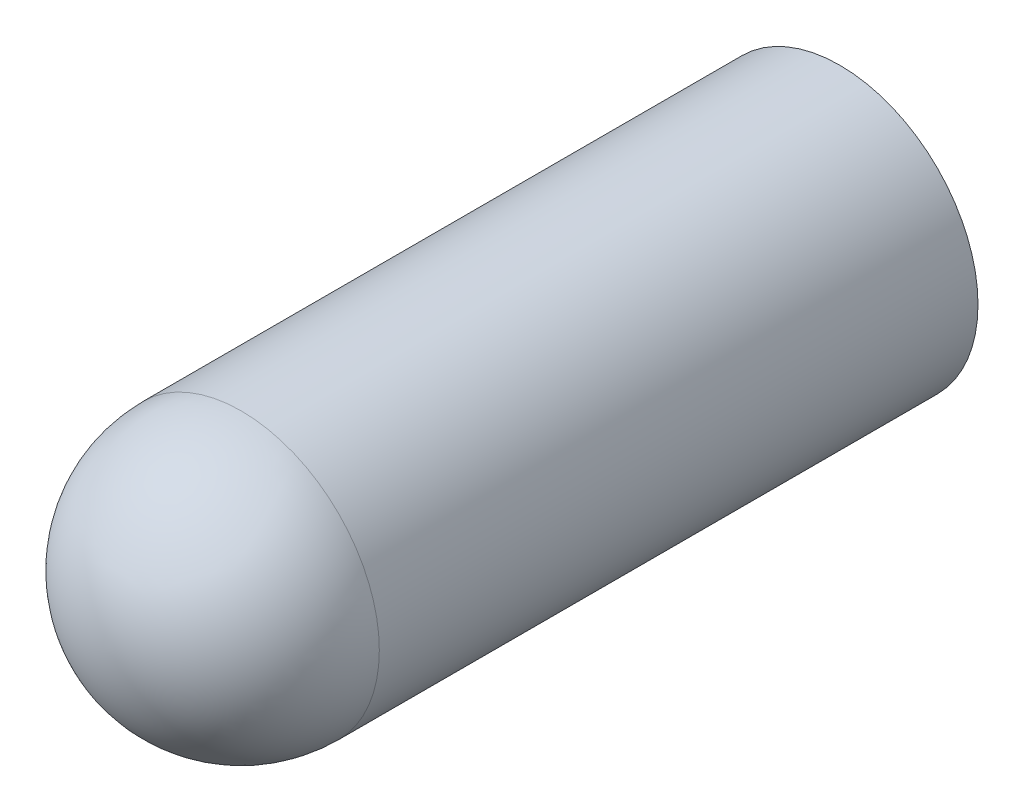
ISO-10303-21;
HEADER;
FILE_DESCRIPTION(('STEP AP214'),'2;1');
FILE_NAME('part.step','',(''),(''),'','','');
FILE_SCHEMA(('AUTOMOTIVE_DESIGN { 1 0 10303 214 1 1 1 1 }'));
ENDSEC;
DATA;
#1=APPLICATION_CONTEXT('core data for automotive mechanical design processes');
#2=APPLICATION_PROTOCOL_DEFINITION('international standard','automotive_design',2000,#1);
#3=PRODUCT_CONTEXT('',#1,'mechanical');
#4=PRODUCT('Part','Part','',(#3));
#5=PRODUCT_RELATED_PRODUCT_CATEGORY('part','',(#4));
#6=PRODUCT_DEFINITION_FORMATION('','',#4);
#7=PRODUCT_DEFINITION_CONTEXT('part definition',#1,'design');
#8=PRODUCT_DEFINITION('design','',#6,#7);
#9=PRODUCT_DEFINITION_SHAPE('','',#8);
#10=(LENGTH_UNIT() NAMED_UNIT(*) SI_UNIT(.MILLI.,.METRE.));
#11=(NAMED_UNIT(*) PLANE_ANGLE_UNIT() SI_UNIT($,.RADIAN.));
#12=(NAMED_UNIT(*) SI_UNIT($,.STERADIAN.) SOLID_ANGLE_UNIT());
#13=UNCERTAINTY_MEASURE_WITH_UNIT(LENGTH_MEASURE(1.E-05),#10,'distance_accuracy_value','');
#14=(GEOMETRIC_REPRESENTATION_CONTEXT(3) GLOBAL_UNCERTAINTY_ASSIGNED_CONTEXT((#13)) GLOBAL_UNIT_ASSIGNED_CONTEXT((#10,
#11,#12)) REPRESENTATION_CONTEXT('',''));
#15=CARTESIAN_POINT('',(0.,0.,0.));
#16=DIRECTION('',(0.,0.,1.));
#17=DIRECTION('',(1.,0.,0.));
#18=AXIS2_PLACEMENT_3D('',#15,#16,#17);
#19=CARTESIAN_POINT('',(0.,0.,8.));
#20=DIRECTION('',(0.,0.,-1.));
#21=DIRECTION('',(-1.,0.,0.));
#22=AXIS2_PLACEMENT_3D('',#19,#20,#21);
#23=CYLINDRICAL_SURFACE('',#22,1.5);
#24=CARTESIAN_POINT('',(0.,0.,6.5));
#25=DIRECTION('',(0.,0.,-1.));
#26=DIRECTION('',(-1.,0.,0.));
#27=AXIS2_PLACEMENT_3D('',#24,#25,#26);
#28=CIRCLE('',#27,1.5);
#29=CARTESIAN_POINT('',(-1.5,0.,6.5));
#30=VERTEX_POINT('',#29);
#31=EDGE_CURVE('E10',#30,#30,#28,.T.);
#32=ORIENTED_EDGE('',*,*,#31,.T.);
#33=EDGE_LOOP('',(#32));
#34=FACE_BOUND('',#33,.T.);
#35=CARTESIAN_POINT('',(0.,0.,0.));
#36=DIRECTION('',(0.,0.,1.));
#37=DIRECTION('',(1.,0.,0.));
#38=AXIS2_PLACEMENT_3D('',#35,#36,#37);
#39=CIRCLE('',#38,1.5);
#40=CARTESIAN_POINT('',(1.5,0.,0.));
#41=VERTEX_POINT('',#40);
#42=EDGE_CURVE('E38',#41,#41,#39,.T.);
#43=ORIENTED_EDGE('',*,*,#42,.T.);
#44=EDGE_LOOP('',(#43));
#45=FACE_BOUND('',#44,.T.);
#46=ADVANCED_FACE('F31',(#34,#45),#23,.T.);
#47=CARTESIAN_POINT('',(0.,0.,0.));
#48=DIRECTION('',(0.,0.,1.));
#49=DIRECTION('',(1.,0.,0.));
#50=AXIS2_PLACEMENT_3D('',#47,#48,#49);
#51=PLANE('',#50);
#52=ORIENTED_EDGE('',*,*,#42,.F.);
#53=EDGE_LOOP('',(#52));
#54=FACE_BOUND('',#53,.T.);
#55=ADVANCED_FACE('F45',(#54),#51,.F.);
#56=CARTESIAN_POINT('',(0.,0.,6.5));
#57=DIRECTION('',(0.,0.,1.));
#58=DIRECTION('',(1.,0.,0.));
#59=AXIS2_PLACEMENT_3D('',#56,#57,#58);
#60=SPHERICAL_SURFACE('',#59,1.5);
#61=ORIENTED_EDGE('',*,*,#31,.F.);
#62=EDGE_LOOP('',(#61));
#63=FACE_BOUND('',#62,.T.);
#64=ADVANCED_FACE('F33',(#63),#60,.T.);
#65=CLOSED_SHELL('',(#46,#55,#64));
#66=MANIFOLD_SOLID_BREP('B2',#65);
#67=ADVANCED_BREP_SHAPE_REPRESENTATION('',(#18,#66),#14);
#68=SHAPE_DEFINITION_REPRESENTATION(#9,#67);
ENDSEC;
END-ISO-10303-21;
